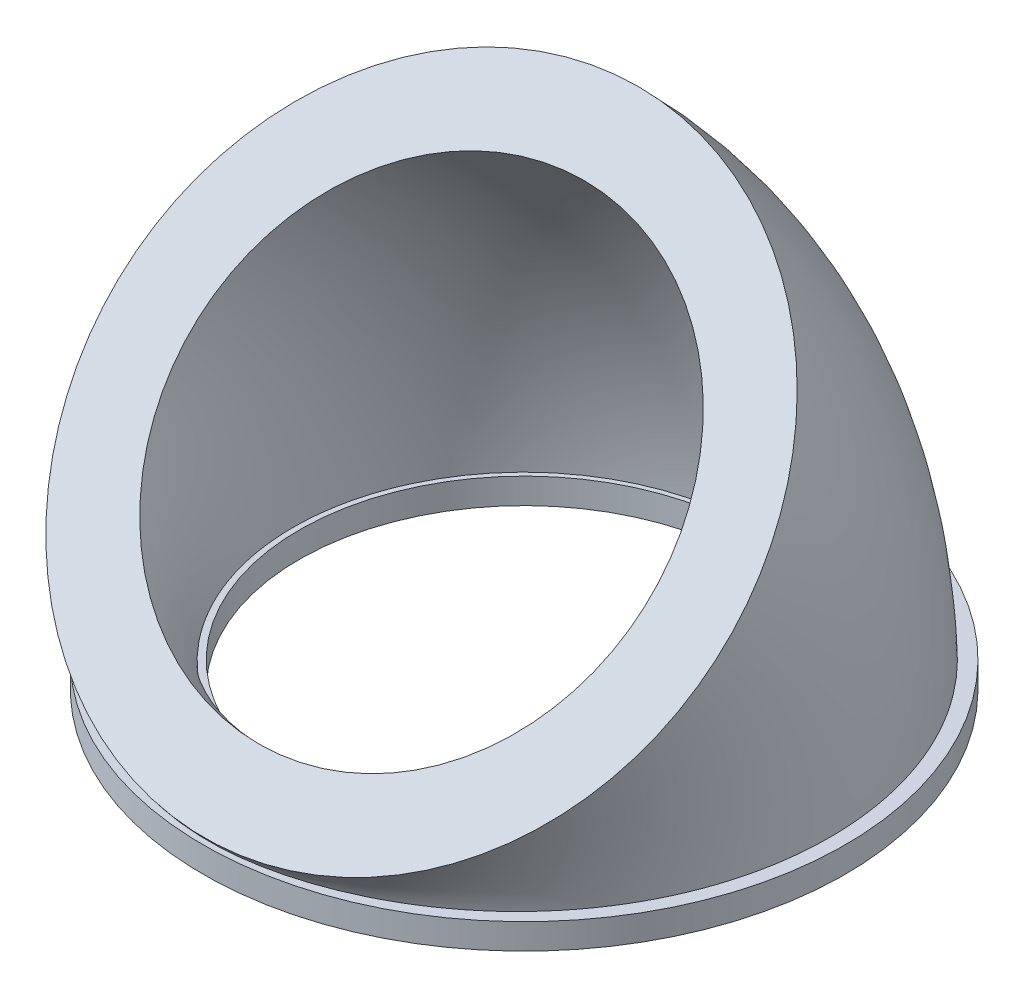
ISO-10303-21;
HEADER;
FILE_DESCRIPTION(('STEP AP214'),'2;1');
FILE_NAME('part.step','',(''),(''),'','','');
FILE_SCHEMA(('AUTOMOTIVE_DESIGN { 1 0 10303 214 1 1 1 1 }'));
ENDSEC;
DATA;
#1=APPLICATION_CONTEXT('core data for automotive mechanical design processes');
#2=APPLICATION_PROTOCOL_DEFINITION('international standard','automotive_design',2000,#1);
#3=PRODUCT_CONTEXT('',#1,'mechanical');
#4=PRODUCT('Part','Part','',(#3));
#5=PRODUCT_RELATED_PRODUCT_CATEGORY('part','',(#4));
#6=PRODUCT_DEFINITION_FORMATION('','',#4);
#7=PRODUCT_DEFINITION_CONTEXT('part definition',#1,'design');
#8=PRODUCT_DEFINITION('design','',#6,#7);
#9=PRODUCT_DEFINITION_SHAPE('','',#8);
#10=(LENGTH_UNIT() NAMED_UNIT(*) SI_UNIT(.MILLI.,.METRE.));
#11=(NAMED_UNIT(*) PLANE_ANGLE_UNIT() SI_UNIT($,.RADIAN.));
#12=(NAMED_UNIT(*) SI_UNIT($,.STERADIAN.) SOLID_ANGLE_UNIT());
#13=UNCERTAINTY_MEASURE_WITH_UNIT(LENGTH_MEASURE(1.E-05),#10,'distance_accuracy_value','');
#14=(GEOMETRIC_REPRESENTATION_CONTEXT(3) GLOBAL_UNCERTAINTY_ASSIGNED_CONTEXT((#13)) GLOBAL_UNIT_ASSIGNED_CONTEXT((#10,
#11,#12)) REPRESENTATION_CONTEXT('',''));
#15=CARTESIAN_POINT('',(0.,0.,0.));
#16=DIRECTION('',(0.,0.,1.));
#17=DIRECTION('',(1.,0.,0.));
#18=AXIS2_PLACEMENT_3D('',#15,#16,#17);
#19=CARTESIAN_POINT('',(0.,-27.4233841458271,-10.));
#20=DIRECTION('',(-1.,0.,0.));
#21=DIRECTION('',(0.,0.,1.));
#22=AXIS2_PLACEMENT_3D('',#19,#20,#21);
#23=TOROIDAL_SURFACE('',#22,27.4233841458271,18.);
#24=CARTESIAN_POINT('',(0.,-8.0321232532291,-29.391260892598));
#25=DIRECTION('',(0.,-0.707106781186547,-0.707106781186547));
#26=DIRECTION('',(0.,0.707106781186548,-0.707106781186548));
#27=AXIS2_PLACEMENT_3D('',#24,#25,#26);
#28=CIRCLE('',#27,18.);
#29=CARTESIAN_POINT('',(0.,4.69579880812875,-42.1191829539559));
#30=VERTEX_POINT('',#29);
#31=EDGE_CURVE('E92',#30,#30,#28,.F.);
#32=ORIENTED_EDGE('',*,*,#31,.T.);
#33=EDGE_LOOP('',(#32));
#34=FACE_BOUND('',#33,.T.);
#35=CARTESIAN_POINT('',(-12.8673389942519,-25.4233841458271,-49.9603268087383));
#36=CARTESIAN_POINT('',(-13.22127898729,-25.4233841458271,-49.5980514448734));
#37=CARTESIAN_POINT('',(-13.5598968853151,-25.4233841458271,-49.2208512059999));
#38=CARTESIAN_POINT('',(-14.0430573726064,-25.4233841458271,-48.6347173289062));
#39=CARTESIAN_POINT('',(-14.2000087899294,-25.4233841458271,-48.4359133725652));
#40=CARTESIAN_POINT('',(-14.5054327316994,-25.4233841458271,-48.0318134599778));
#41=CARTESIAN_POINT('',(-14.653902964633,-25.4233841458271,-47.8265157722657));
#42=CARTESIAN_POINT('',(-15.0863822623848,-25.4233841458271,-47.2011259777443));
#43=CARTESIAN_POINT('',(-15.3572234798953,-25.4233841458271,-46.7718240331977));
#44=CARTESIAN_POINT('',(-15.8617356357748,-25.4233841458271,-45.8919107901087));
#45=CARTESIAN_POINT('',(-16.0954066568381,-25.4233841458271,-45.4412995389771));
#46=CARTESIAN_POINT('',(-16.4167302566389,-25.4233841458271,-44.7520246447946));
#47=CARTESIAN_POINT('',(-16.5189649233989,-25.4233841458271,-44.5200655427819));
#48=CARTESIAN_POINT('',(-16.7135466719222,-25.4233841458271,-44.0521078553894));
#49=CARTESIAN_POINT('',(-16.805896279149,-25.4233841458271,-43.8161103197171));
#50=CARTESIAN_POINT('',(-17.0679203074345,-25.4233841458271,-43.1025438613267));
#51=CARTESIAN_POINT('',(-17.2225867504165,-25.4233841458271,-42.6193650027692));
#52=CARTESIAN_POINT('',(-17.4906673853964,-25.4233841458271,-41.6418990403028));
#53=CARTESIAN_POINT('',(-17.6040922502046,-25.4233841458271,-41.147614845525));
#54=CARTESIAN_POINT('',(-17.789002690455,-25.4233841458271,-40.1512478130978));
#55=CARTESIAN_POINT('',(-17.8604883808088,-25.4233841458271,-39.6491649968203));
#56=CARTESIAN_POINT('',(-17.9611171075555,-25.4233841458271,-38.6399842490112));
#57=CARTESIAN_POINT('',(-17.9901936328877,-25.4233841458271,-38.1328796928988));
#58=CARTESIAN_POINT('',(-18.0056240164112,-25.4233841458271,-37.1180203208683));
#59=CARTESIAN_POINT('',(-17.9919778089794,-25.4233841458271,-36.6102655039525));
#60=CARTESIAN_POINT('',(-17.9220958905224,-25.4233841458271,-35.5976717419738));
#61=CARTESIAN_POINT('',(-17.8658581186314,-25.4233841458271,-35.0928329391982));
#62=CARTESIAN_POINT('',(-17.7112299948006,-25.4233841458271,-34.0896532087089));
#63=CARTESIAN_POINT('',(-17.6128395558906,-25.4233841458271,-33.5913122944039));
#64=CARTESIAN_POINT('',(-17.3742746437865,-25.4233841458271,-32.6031028922983));
#65=CARTESIAN_POINT('',(-17.2339719065843,-25.4233841458271,-32.113265367977));
#66=CARTESIAN_POINT('',(-16.9127322694109,-25.4233841458271,-31.1471017276268));
#67=CARTESIAN_POINT('',(-16.731795296979,-25.4233841458271,-30.6707756356938));
#68=CARTESIAN_POINT('',(-16.3306066487976,-25.4233841458271,-29.7349737398761));
#69=CARTESIAN_POINT('',(-16.1103545815562,-25.4233841458271,-29.27549810384));
#70=CARTESIAN_POINT('',(-15.6321284462026,-25.4233841458271,-28.3766161839419));
#71=CARTESIAN_POINT('',(-15.3741542675022,-25.4233841458271,-27.9372099589217));
#72=CARTESIAN_POINT('',(-14.8211699028884,-25.4233841458271,-27.0797359692378));
#73=CARTESIAN_POINT('',(-14.526008697728,-25.4233841458271,-26.6617655906432));
#74=CARTESIAN_POINT('',(-13.9016174699892,-25.4233841458271,-25.8520967905658));
#75=CARTESIAN_POINT('',(-13.5723873265887,-25.4233841458271,-25.4603984622622));
#76=CARTESIAN_POINT('',(-12.8821667841321,-25.4233841458271,-24.7060121170377));
#77=CARTESIAN_POINT('',(-12.5211741917677,-25.4233841458271,-24.3433261068259));
#78=CARTESIAN_POINT('',(-11.7699838430686,-25.4233841458271,-23.6495748984781));
#79=CARTESIAN_POINT('',(-11.3797860374112,-25.4233841458271,-23.3185097537468));
#80=CARTESIAN_POINT('',(-10.5718266395488,-25.4233841458271,-22.6895537856968));
#81=CARTESIAN_POINT('',(-10.1539940627221,-25.4233841458271,-22.3917541324767));
#82=CARTESIAN_POINT('',(-9.29462199510146,-25.4233841458271,-21.8325776879138));
#83=CARTESIAN_POINT('',(-8.85308240118584,-25.4233841458271,-21.5712010550231));
#84=CARTESIAN_POINT('',(-7.94940208065951,-25.4233841458271,-21.0869148009635));
#85=CARTESIAN_POINT('',(-7.48726205947704,-25.4233841458271,-20.8640038638705));
#86=CARTESIAN_POINT('',(-6.54562678744285,-25.4233841458271,-20.4584717940819));
#87=CARTESIAN_POINT('',(-6.06613171436241,-25.4233841458271,-20.2758502488298));
#88=CARTESIAN_POINT('',(-5.09733922124915,-25.4233841458271,-19.9538673648576));
#89=CARTESIAN_POINT('',(-4.60815934661876,-25.4233841458271,-19.8141524445216));
#90=CARTESIAN_POINT('',(-3.61961347423631,-25.4233841458271,-19.5771936118676));
#91=CARTESIAN_POINT('',(-3.12024754811763,-25.4233841458271,-19.4799494009821));
#92=CARTESIAN_POINT('',(-2.11508263246179,-25.4233841458271,-19.3289009371675));
#93=CARTESIAN_POINT('',(-1.60928490574644,-25.4233841458271,-19.2750882866582));
#94=CARTESIAN_POINT('',(-0.594932997183733,-25.4233841458271,-19.2114255564899));
#95=CARTESIAN_POINT('',(-0.0863788624486613,-25.4233841458271,-19.201574727797));
#96=CARTESIAN_POINT('',(0.918745478439486,-25.4233841458271,-19.2256732368799));
#97=CARTESIAN_POINT('',(1.415338411143,-25.4233841458271,-19.2586860888581));
#98=CARTESIAN_POINT('',(2.40394864966357,-25.4233841458271,-19.366569466441));
#99=CARTESIAN_POINT('',(2.89596601667815,-25.4233841458271,-19.4414394313921));
#100=CARTESIAN_POINT('',(3.87198687069252,-25.4233841458271,-19.6323232891759));
#101=CARTESIAN_POINT('',(4.3559897225033,-25.4233841458271,-19.7483404269392));
#102=CARTESIAN_POINT('',(5.31259015038147,-25.4233841458271,-20.0204596722467));
#103=CARTESIAN_POINT('',(5.78518761537671,-25.4233841458271,-20.1765621699926));
#104=CARTESIAN_POINT('',(6.71630920440257,-25.4233841458271,-20.5277230480183));
#105=CARTESIAN_POINT('',(7.17481611580262,-25.4233841458271,-20.7228270468689));
#106=CARTESIAN_POINT('',(8.07410311276838,-25.4233841458271,-21.150308715827));
#107=CARTESIAN_POINT('',(8.51488324585425,-25.4233841458271,-21.3826862860071));
#108=CARTESIAN_POINT('',(9.37582507896328,-25.4233841458271,-21.8829724771248));
#109=CARTESIAN_POINT('',(9.79598560326827,-25.4233841458271,-22.1508831209203));
#110=CARTESIAN_POINT('',(10.6128953967289,-25.4233841458271,-22.7202940207847));
#111=CARTESIAN_POINT('',(11.00964432312,-25.4233841458271,-23.0217947684531));
#112=CARTESIAN_POINT('',(11.7852893422134,-25.4233841458271,-23.6630475862038));
#113=CARTESIAN_POINT('',(12.1636251839205,-25.4233841458271,-24.0034776103334));
#114=CARTESIAN_POINT('',(12.8905270290648,-25.4233841458271,-24.7147651500442));
#115=CARTESIAN_POINT('',(13.2390926448981,-25.4233841458271,-25.0856230616687));
#116=CARTESIAN_POINT('',(13.9040329165932,-25.4233841458271,-25.8551756172776));
#117=CARTESIAN_POINT('',(14.2204066013384,-25.4233841458271,-26.2538711004115));
#118=CARTESIAN_POINT('',(14.8187259154273,-25.4233841458271,-27.0763083088157));
#119=CARTESIAN_POINT('',(15.1006715044427,-25.4233841458271,-27.5000500634236));
#120=CARTESIAN_POINT('',(15.6302318617216,-25.4233841458271,-28.3730899114821));
#121=CARTESIAN_POINT('',(15.8775560235134,-25.4233841458271,-28.8225643268408));
#122=CARTESIAN_POINT('',(16.3333949889262,-25.4233841458271,-29.7407837646239));
#123=CARTESIAN_POINT('',(16.5419095258524,-25.4233841458271,-30.2095289194473));
#124=CARTESIAN_POINT('',(16.9185958015798,-25.4233841458271,-31.1629616915369));
#125=CARTESIAN_POINT('',(17.0867673969814,-25.4233841458271,-31.6476493654641));
#126=CARTESIAN_POINT('',(17.381515781354,-25.4233841458271,-32.6295108162576));
#127=CARTESIAN_POINT('',(17.5080927370204,-25.4233841458271,-33.1266845430761));
#128=CARTESIAN_POINT('',(17.7184190727548,-25.4233841458271,-34.1286358336675));
#129=CARTESIAN_POINT('',(17.8022809278958,-25.4233841458271,-34.6333897872241));
#130=CARTESIAN_POINT('',(17.9270366074452,-25.4233841458271,-35.648181301322));
#131=CARTESIAN_POINT('',(17.9679304673323,-25.4233841458271,-36.1582188575002));
#132=CARTESIAN_POINT('',(18.0064147170119,-25.4233841458271,-37.1799176254889));
#133=CARTESIAN_POINT('',(18.0040058123927,-25.4233841458271,-37.6915788107077));
#134=CARTESIAN_POINT('',(17.9558648179577,-25.4233841458271,-38.7128591918099));
#135=CARTESIAN_POINT('',(17.9101328541752,-25.4233841458271,-39.2224783936294));
#136=CARTESIAN_POINT('',(17.7759223182169,-25.4233841458271,-40.2338824637027));
#137=CARTESIAN_POINT('',(17.6876236511079,-25.4233841458271,-40.7356912103847));
#138=CARTESIAN_POINT('',(17.4689579826757,-25.4233841458271,-41.7300578089467));
#139=CARTESIAN_POINT('',(17.3385910909482,-25.4233841458271,-42.2226156849234));
#140=CARTESIAN_POINT('',(17.0366966025323,-25.4233841458271,-43.1949448418903));
#141=CARTESIAN_POINT('',(16.8651695663733,-25.4233841458271,-43.6747162969104));
#142=CARTESIAN_POINT('',(16.4821588011217,-25.4233841458271,-44.6180361598305));
#143=CARTESIAN_POINT('',(16.2706751358363,-25.4233841458271,-45.0815845936358));
#144=CARTESIAN_POINT('',(15.8099611846555,-25.4233841458271,-45.9877233881757));
#145=CARTESIAN_POINT('',(15.5608495889455,-25.4233841458271,-46.4303740990363));
#146=CARTESIAN_POINT('',(15.0261634657792,-25.4233841458271,-47.2930763707128));
#147=CARTESIAN_POINT('',(14.7405890147418,-25.4233841458271,-47.7131279788893));
#148=CARTESIAN_POINT('',(14.1350030850947,-25.4233841458271,-48.527623046095));
#149=CARTESIAN_POINT('',(13.8149918328002,-25.4233841458271,-48.9220666733899));
#150=CARTESIAN_POINT('',(13.1428046109194,-25.4233841458271,-49.6825230124747));
#151=CARTESIAN_POINT('',(12.7906286694387,-25.4233841458271,-50.048535749107));
#152=CARTESIAN_POINT('',(12.0573325706652,-25.4233841458271,-50.7488255480964));
#153=CARTESIAN_POINT('',(11.6762699215256,-25.4233841458271,-51.0831628310655));
#154=CARTESIAN_POINT('',(10.8873093633097,-25.4233841458271,-51.71851394845));
#155=CARTESIAN_POINT('',(10.4794114906816,-25.4233841458271,-52.0195278281246));
#156=CARTESIAN_POINT('',(9.63968228353082,-25.4233841458271,-52.5860794847574));
#157=CARTESIAN_POINT('',(9.20785102107229,-25.4233841458271,-52.8516173685266));
#158=CARTESIAN_POINT('',(8.32332772968958,-25.4233841458271,-53.3453189135021));
#159=CARTESIAN_POINT('',(7.87063571083879,-25.4233841458271,-53.5734825927555));
#160=CARTESIAN_POINT('',(6.94812618906445,-25.4233841458271,-53.9905725684578));
#161=CARTESIAN_POINT('',(6.47832816498741,-25.4233841458271,-54.1795419488315));
#162=CARTESIAN_POINT('',(5.52447650041942,-25.4233841458271,-54.5172109640207));
#163=CARTESIAN_POINT('',(5.04042286873609,-25.4233841458271,-54.6659106237157));
#164=CARTESIAN_POINT('',(4.06152416462753,-25.4233841458271,-54.9219726994479));
#165=CARTESIAN_POINT('',(3.56667954616905,-25.4233841458271,-55.0293368509001));
#166=CARTESIAN_POINT('',(2.56970293725422,-25.4233841458271,-55.2019701229618));
#167=CARTESIAN_POINT('',(2.06757095560337,-25.4233841458271,-55.2672392944313));
#168=CARTESIAN_POINT('',(1.0599229744158,-25.4233841458271,-55.3551860353629));
#169=CARTESIAN_POINT('',(0.55440944686945,-25.4233841458271,-55.3778918947942));
#170=CARTESIAN_POINT('',(-0.456717911714988,-25.4233841458271,-55.3806406266289));
#171=CARTESIAN_POINT('',(-0.962331743097287,-25.4233841458271,-55.3606833500006));
#172=CARTESIAN_POINT('',(-1.97027405168103,-25.4233841458271,-55.2782198320547));
#173=CARTESIAN_POINT('',(-2.47260165860809,-25.4233841458271,-55.2157027464727));
#174=CARTESIAN_POINT('',(-3.2206407628951,-25.4233841458271,-55.0903874157675));
#175=CARTESIAN_POINT('',(-3.46908808766829,-25.4233841458271,-55.0433565491624));
#176=CARTESIAN_POINT('',(-3.96384453348637,-25.4233841458271,-54.9388520264274));
#177=CARTESIAN_POINT('',(-4.21015309176606,-25.4233841458271,-54.8813757041518));
#178=CARTESIAN_POINT('',(-4.94520129811733,-25.4233841458271,-54.6934115865622));
#179=CARTESIAN_POINT('',(-5.4300555660959,-25.4233841458271,-54.5473899668028));
#180=CARTESIAN_POINT('',(-6.38572972379729,-25.4233841458271,-54.2149896681923));
#181=CARTESIAN_POINT('',(-6.85654956035937,-25.4233841458271,-54.028610836495));
#182=CARTESIAN_POINT('',(-7.54942734700609,-25.4233841458271,-53.719940150175));
#183=CARTESIAN_POINT('',(-7.77808075255478,-25.4233841458271,-53.612243854131));
#184=CARTESIAN_POINT('',(-8.23058937457469,-25.4233841458271,-53.3873464790641));
#185=CARTESIAN_POINT('',(-8.45444586620603,-25.4233841458271,-53.2701479666515));
#186=CARTESIAN_POINT('',(-9.11822080150776,-25.4233841458271,-52.9046096906629));
#187=CARTESIAN_POINT('',(-9.55050753578366,-25.4233841458271,-52.642254617272));
#188=CARTESIAN_POINT('',(-10.4938613528003,-25.4233841458271,-52.0138850643813));
#189=CARTESIAN_POINT('',(-10.998496151371,-25.4233841458271,-51.6381822253663));
#190=CARTESIAN_POINT('',(-11.9657248690622,-25.4233841458271,-50.8360827184446));
#191=CARTESIAN_POINT('',(-12.4283187856273,-25.4233841458271,-50.4096860474564));
#192=CARTESIAN_POINT('',(-12.8673389942519,-25.4233841458271,-49.9603268087383));
#193=B_SPLINE_CURVE_WITH_KNOTS('',3,(#35,#36,#37,#38,#39,#40,#41,#42,#43,#44,#45,#46,#47,#48,
#49,#50,#51,#52,#53,#54,#55,#56,#57,#58,#59,#60,#61,#62,#63,#64,#65,#66,#67,#68,#69,#70,#71,#72,
#73,#74,#75,#76,#77,#78,#79,#80,#81,#82,#83,#84,#85,#86,#87,#88,#89,#90,#91,#92,#93,#94,#95,#96,
#97,#98,#99,#100,#101,#102,#103,#104,#105,#106,#107,#108,#109,#110,#111,#112,#113,#114,#115,
#116,#117,#118,#119,#120,#121,#122,#123,#124,#125,#126,#127,#128,#129,#130,#131,#132,#133,#134,
#135,#136,#137,#138,#139,#140,#141,#142,#143,#144,#145,#146,#147,#148,#149,#150,#151,#152,#153,
#154,#155,#156,#157,#158,#159,#160,#161,#162,#163,#164,#165,#166,#167,#168,#169,#170,#171,#172,
#173,#174,#175,#176,#177,#178,#179,#180,#181,#182,#183,#184,#185,#186,#187,#188,#189,#190,#191,
#192),.UNSPECIFIED.,.T.,.F.,(4,2,2,2,2,2,2,2,2,2,2,2,2,2,2,2,2,2,2,2,2,2,2,2,2,2,2,2,2,2,2,2,2,
2,2,2,2,2,2,2,2,2,2,2,2,2,2,2,2,2,2,2,2,2,2,2,2,2,2,2,2,2,2,2,2,2,2,2,2,2,2,2,2,2,2,2,2,2,4),
(0.,1.51881080097557,2.27848581711989,3.03836512677905,4.55923543960673,6.08010236883053,
6.84037316357209,7.60044925619327,9.12048239403759,10.6401218856653,12.1597572135218,
13.6817732597837,15.2037916438989,16.725883678188,18.2479788529011,19.774780657599,
21.3015851849747,22.8284049168161,24.3552291248633,25.888466812589,27.4217099379736,
28.9550590223888,30.4884106964355,32.0258667105597,33.5633294129099,35.1007395077252,
36.6381338589937,38.16249617985,39.6868477843265,41.21090458167,42.7349354115984,
44.2262229164468,45.7174904467757,47.2088756069625,48.7002752852497,50.1934297129264,
51.6865801376406,53.1798156022442,54.6730729235906,56.1981359649437,57.723218859366,
59.2483477465104,60.77347842014,62.3107282548784,63.8479886530162,65.3852545152925,
66.9225142167249,68.4557048881577,69.9888942936354,71.5220587168889,73.0552186799538,
74.5819549195222,76.1086871816888,77.6353986536084,79.1621076875278,80.6840978668401,
82.2060848564092,83.7280618442424,85.2500375021825,86.7690589745326,88.2880783837542,
89.8070932194121,91.3261073215649,92.8434427087933,94.3607771585787,95.8780478981978,
97.3953168046148,98.9115768907895,100.427842273605,101.944494146406,102.702879802517,
103.461459304997,104.978642297685,106.495831036551,107.253875624548,108.011716137568,
109.526864106388,111.410767048383,113.294670104892),.UNSPECIFIED.);
#194=CARTESIAN_POINT('',(-12.8673389942519,-25.4233841458271,-49.9603268087383));
#195=VERTEX_POINT('',#194);
#196=EDGE_CURVE('E10',#195,#195,#193,.T.);
#197=ORIENTED_EDGE('',*,*,#196,.F.);
#198=EDGE_LOOP('',(#197));
#199=FACE_BOUND('',#198,.T.);
#200=ADVANCED_FACE('F33',(#34,#199),#23,.F.);
#201=CARTESIAN_POINT('',(0.,-27.4233841458271,-10.));
#202=DIRECTION('',(-1.,0.,0.));
#203=DIRECTION('',(0.,0.,1.));
#204=AXIS2_PLACEMENT_3D('',#201,#202,#203);
#205=TOROIDAL_SURFACE('',#204,27.4233841458271,24.);
#206=CARTESIAN_POINT('',(0.,-8.0321232532291,-29.391260892598));
#207=DIRECTION('',(0.,-0.707106781186547,-0.707106781186547));
#208=DIRECTION('',(0.,0.707106781186548,-0.707106781186548));
#209=AXIS2_PLACEMENT_3D('',#206,#207,#208);
#210=CIRCLE('',#209,24.);
#211=CARTESIAN_POINT('',(0.,8.93843949524804,-46.3618236410751));
#212=VERTEX_POINT('',#211);
#213=EDGE_CURVE('E50',#212,#212,#210,.T.);
#214=ORIENTED_EDGE('',*,*,#213,.T.);
#215=EDGE_LOOP('',(#214));
#216=FACE_BOUND('',#215,.T.);
#217=CARTESIAN_POINT('',(-17.0079155178827,-25.4233841458271,-54.3113995799606));
#218=CARTESIAN_POINT('',(-16.5324612347913,-25.4233841458271,-54.7894359532409));
#219=CARTESIAN_POINT('',(-16.0368107429161,-25.4233841458271,-55.2474735019813));
#220=CARTESIAN_POINT('',(-15.0086662780967,-25.4233841458271,-56.1202249265997));
#221=CARTESIAN_POINT('',(-14.4761676944385,-25.4233841458271,-56.5349333644551));
#222=CARTESIAN_POINT('',(-13.3778352319365,-25.4233841458271,-57.3182511024736));
#223=CARTESIAN_POINT('',(-12.8119835393426,-25.4233841458271,-57.6868354336855));
#224=CARTESIAN_POINT('',(-11.6512518298994,-25.4233841458271,-58.374995676379));
#225=CARTESIAN_POINT('',(-11.0563727262388,-25.4233841458271,-58.6945731282855));
#226=CARTESIAN_POINT('',(-9.84192143055866,-25.4233841458271,-59.282396317542));
#227=CARTESIAN_POINT('',(-9.2223543165692,-25.4233841458271,-59.5506525458759));
#228=CARTESIAN_POINT('',(-7.96281357611869,-25.4233841458271,-60.0340027825281));
#229=CARTESIAN_POINT('',(-7.32283979685449,-25.4233841458271,-60.2490963926641));
#230=CARTESIAN_POINT('',(-6.02711875510084,-25.4233841458271,-60.6245626121567));
#231=CARTESIAN_POINT('',(-5.37137337185056,-25.4233841458271,-60.7849417066896));
#232=CARTESIAN_POINT('',(-4.0487013125602,-25.4233841458271,-61.0498701921955));
#233=CARTESIAN_POINT('',(-3.38177465943237,-25.4233841458271,-61.154419697558));
#234=CARTESIAN_POINT('',(-2.04165250222545,-25.4233841458271,-61.3069246587908));
#235=CARTESIAN_POINT('',(-1.36845862323132,-25.4233841458271,-61.3548943952483));
#236=CARTESIAN_POINT('',(-0.0204226365821484,-25.4233841458271,-61.3939457488149));
#237=CARTESIAN_POINT('',(0.65441947150485,-25.4233841458271,-61.3850273510137));
#238=CARTESIAN_POINT('',(2.00096302424663,-25.4233841458271,-61.3103653998751));
#239=CARTESIAN_POINT('',(2.67266442153175,-25.4233841458271,-61.244620992223));
#240=CARTESIAN_POINT('',(4.00813991628578,-25.4233841458271,-61.0567745235654));
#241=CARTESIAN_POINT('',(4.67191401458382,-25.4233841458271,-60.9346724684545));
#242=CARTESIAN_POINT('',(5.98674010706616,-25.4233841458271,-60.6349982421481));
#243=CARTESIAN_POINT('',(6.63779355010674,-25.4233841458271,-60.4574324277565));
#244=CARTESIAN_POINT('',(7.92262951715957,-25.4233841458271,-60.0480915328455));
#245=CARTESIAN_POINT('',(8.55641204328577,-25.4233841458271,-59.8163164589614));
#246=CARTESIAN_POINT('',(9.80220324346082,-25.4233841458271,-59.3002083938574));
#247=CARTESIAN_POINT('',(10.4142119157396,-25.4233841458271,-59.0158753983652));
#248=CARTESIAN_POINT('',(11.6121087444552,-25.4233841458271,-58.3966770286395));
#249=CARTESIAN_POINT('',(12.1979968962395,-25.4233841458271,-58.0618116454059));
#250=CARTESIAN_POINT('',(13.3395967801545,-25.4233841458271,-57.343868643752));
#251=CARTESIAN_POINT('',(13.8953030384529,-25.4233841458271,-56.9607823214309));
#252=CARTESIAN_POINT('',(14.9724812143732,-25.4233841458271,-56.1491738629249));
#253=CARTESIAN_POINT('',(15.4939531316254,-25.4233841458271,-55.7206517262492));
#254=CARTESIAN_POINT('',(16.4989638068204,-25.4233841458271,-54.8212243911545));
#255=CARTESIAN_POINT('',(16.9825026635908,-25.4233841458271,-54.350319303163));
#256=CARTESIAN_POINT('',(17.908224086183,-25.4233841458271,-53.3694772269208));
#257=CARTESIAN_POINT('',(18.350406635598,-25.4233841458271,-52.8595402231853));
#258=CARTESIAN_POINT('',(19.190510426697,-25.4233841458271,-51.8039833733322));
#259=CARTESIAN_POINT('',(19.5884081296199,-25.4233841458271,-51.2583447930726));
#260=CARTESIAN_POINT('',(20.336861335624,-25.4233841458271,-50.1355111296893));
#261=CARTESIAN_POINT('',(20.6874168312422,-25.4233841458271,-49.5583160415911));
#262=CARTESIAN_POINT('',(21.3387188464543,-25.4233841458271,-48.3764696561757));
#263=CARTESIAN_POINT('',(21.6394648704053,-25.4233841458271,-47.7718180857214));
#264=CARTESIAN_POINT('',(22.1890331357678,-25.4233841458271,-46.5393619039736));
#265=CARTESIAN_POINT('',(22.4378553352543,-25.4233841458271,-45.911557273986));
#266=CARTESIAN_POINT('',(22.8820885886181,-25.4233841458271,-44.6365392920339));
#267=CARTESIAN_POINT('',(23.0774395520793,-25.4233841458271,-43.9893050038925));
#268=CARTESIAN_POINT('',(23.4130091465528,-25.4233841458271,-42.6806997847965));
#269=CARTESIAN_POINT('',(23.5532277596582,-25.4233841458271,-42.0193288492503));
#270=CARTESIAN_POINT('',(23.7775766342045,-25.4233841458271,-40.6871649004617));
#271=CARTESIAN_POINT('',(23.8617087433352,-25.4233841458271,-40.0163721983493));
#272=CARTESIAN_POINT('',(23.9733471386143,-25.4233841458271,-38.6700921402951));
#273=CARTESIAN_POINT('',(24.0008533408966,-25.4233841458271,-37.9946047774016));
#274=CARTESIAN_POINT('',(23.9991043899247,-25.4233841458271,-36.6422195007171));
#275=CARTESIAN_POINT('',(23.9697243707305,-25.4233841458271,-35.9653217491742));
#276=CARTESIAN_POINT('',(23.85423757476,-25.4233841458271,-34.6163852004375));
#277=CARTESIAN_POINT('',(23.7681307627374,-25.4233841458271,-33.9443464062631));
#278=CARTESIAN_POINT('',(23.5398746685924,-25.4233841458271,-32.6097728938472));
#279=CARTESIAN_POINT('',(23.3977185743905,-25.4233841458271,-31.9472393409948));
#280=CARTESIAN_POINT('',(23.0584740139489,-25.4233841458271,-30.6363908347322));
#281=CARTESIAN_POINT('',(22.861385360649,-25.4233841458271,-29.9880759297485));
#282=CARTESIAN_POINT('',(22.4126775940811,-25.4233841458271,-28.7069887384219));
#283=CARTESIAN_POINT('',(22.1607928609669,-25.4233841458271,-28.0743094919903));
#284=CARTESIAN_POINT('',(21.6050078370257,-25.4233841458271,-26.8322322489796));
#285=CARTESIAN_POINT('',(21.3011074769781,-25.4233841458271,-26.2228342833836));
#286=CARTESIAN_POINT('',(20.6437388234476,-25.4233841458271,-25.0317044300954));
#287=CARTESIAN_POINT('',(20.2902898953401,-25.4233841458271,-24.4499618520603));
#288=CARTESIAN_POINT('',(19.5364148435508,-25.4233841458271,-23.3177648527672));
#289=CARTESIAN_POINT('',(19.1359884720533,-25.4233841458271,-22.7673105965842));
#290=CARTESIAN_POINT('',(18.2864833814077,-25.4233841458271,-21.6953332483596));
#291=CARTESIAN_POINT('',(17.8369141528689,-25.4233841458271,-21.1741989117838));
#292=CARTESIAN_POINT('',(16.8962608551802,-25.4233841458271,-20.1708636776699));
#293=CARTESIAN_POINT('',(16.4051763619759,-25.4233841458271,-19.688663177917));
#294=CARTESIAN_POINT('',(15.3846466278133,-25.4233841458271,-18.7656063169983));
#295=CARTESIAN_POINT('',(14.8551613075965,-25.4233841458271,-18.3247942868295));
#296=CARTESIAN_POINT('',(13.7621985974519,-25.4233841458271,-17.4875822359866));
#297=CARTESIAN_POINT('',(13.1987211486909,-25.4233841458271,-17.091182292184));
#298=CARTESIAN_POINT('',(12.0254121950633,-25.4233841458271,-16.3343597045664));
#299=CARTESIAN_POINT('',(11.4147210107696,-25.4233841458271,-15.9752692391128));
#300=CARTESIAN_POINT('',(10.1659053343582,-25.4233841458271,-15.3083552176979));
#301=CARTESIAN_POINT('',(9.52777755970201,-25.4233841458271,-15.0005378176861));
#302=CARTESIAN_POINT('',(8.22869952425467,-25.4233841458271,-14.4387549639843));
#303=CARTESIAN_POINT('',(7.5677676300788,-25.4233841458271,-14.1847472968833));
#304=CARTESIAN_POINT('',(6.56211521889187,-25.4233841458271,-13.8467078381197));
#305=CARTESIAN_POINT('',(6.22450231618976,-25.4233841458271,-13.7411852307422));
#306=CARTESIAN_POINT('',(5.54497261127547,-25.4233841458271,-13.5451219841273));
#307=CARTESIAN_POINT('',(5.20305601767969,-25.4233841458271,-13.4545806216781));
#308=CARTESIAN_POINT('',(4.29602264375459,-25.4233841458271,-13.2365516942833));
#309=CARTESIAN_POINT('',(3.72760827138143,-25.4233841458271,-13.1223205929288));
#310=CARTESIAN_POINT('',(2.86963064961533,-25.4233841458271,-12.9859875933944));
#311=CARTESIAN_POINT('',(2.58274952199152,-25.4233841458271,-12.9463791811757));
#312=CARTESIAN_POINT('',(2.00757605333999,-25.4233841458271,-12.8793515449324));
#313=CARTESIAN_POINT('',(1.71928388530275,-25.4233841458271,-12.851930862777));
#314=CARTESIAN_POINT('',(1.14230861338206,-25.4233841458271,-12.8097482737353));
#315=CARTESIAN_POINT('',(0.853627205038425,-25.4233841458271,-12.7949631660167));
#316=CARTESIAN_POINT('',(0.275891918839661,-25.4233841458271,-12.7782245412945));
#317=CARTESIAN_POINT('',(-0.0131619569970519,-25.4233841458271,-12.7762709550466));
#318=CARTESIAN_POINT('',(-0.591094300338743,-25.4233841458271,-12.7852337385369));
#319=CARTESIAN_POINT('',(-0.879972753414482,-25.4233841458271,-12.7961510527615));
#320=CARTESIAN_POINT('',(-1.45695331433643,-25.4233841458271,-12.8306537838074));
#321=CARTESIAN_POINT('',(-1.74505541717109,-25.4233841458271,-12.8542392822095));
#322=CARTESIAN_POINT('',(-2.60553371643948,-25.4233841458271,-12.9432540780318));
#323=CARTESIAN_POINT('',(-3.17610349447064,-25.4233841458271,-13.0269776753143));
#324=CARTESIAN_POINT('',(-4.30875295134667,-25.4233841458271,-13.2390708370752));
#325=CARTESIAN_POINT('',(-4.87083159364336,-25.4233841458271,-13.3674458071058));
#326=CARTESIAN_POINT('',(-5.98559253467937,-25.4233841458271,-13.6651937360726));
#327=CARTESIAN_POINT('',(-6.53824653559982,-25.4233841458271,-13.8346726434569));
#328=CARTESIAN_POINT('',(-7.63029012669774,-25.4233841458271,-14.2114362718131));
#329=CARTESIAN_POINT('',(-8.16967959641138,-25.4233841458271,-14.4187213359836));
#330=CARTESIAN_POINT('',(-9.9007196562097,-25.4233841458271,-15.1519923825334));
#331=CARTESIAN_POINT('',(-11.0625062810803,-25.4233841458271,-15.7517848461844));
#332=CARTESIAN_POINT('',(-12.7253195572612,-25.4233841458271,-16.7763492472734));
#333=CARTESIAN_POINT('',(-13.2662071572153,-25.4233841458271,-17.1386219743251));
#334=CARTESIAN_POINT('',(-14.3189065007994,-25.4233841458271,-17.9035709178387));
#335=CARTESIAN_POINT('',(-14.8307170961012,-25.4233841458271,-18.3062487282698));
#336=CARTESIAN_POINT('',(-15.8757965897083,-25.4233841458271,-19.1959634974136));
#337=CARTESIAN_POINT('',(-16.4053140617468,-25.4233841458271,-19.6874110206305));
#338=CARTESIAN_POINT('',(-17.4199199811401,-25.4233841458271,-20.7143084774131));
#339=CARTESIAN_POINT('',(-17.9050047328789,-25.4233841458271,-21.2497620640939));
#340=CARTESIAN_POINT('',(-18.8268694429988,-25.4233841458271,-22.3612345539471));
#341=CARTESIAN_POINT('',(-19.2636243611031,-25.4233841458271,-22.9372742346516));
#342=CARTESIAN_POINT('',(-20.0848227290459,-25.4233841458271,-24.1254890737111));
#343=CARTESIAN_POINT('',(-20.4692685654104,-25.4233841458271,-24.7376625816841));
#344=CARTESIAN_POINT('',(-21.1709800416496,-25.4233841458271,-25.9731441914127));
#345=CARTESIAN_POINT('',(-21.4900234394847,-25.4233841458271,-26.595443240161));
#346=CARTESIAN_POINT('',(-22.0735283507929,-25.4233841458271,-27.8651277910511));
#347=CARTESIAN_POINT('',(-22.337990717413,-25.4233841458271,-28.5125129008889));
#348=CARTESIAN_POINT('',(-22.8101351972583,-25.4233841458271,-29.8274882263367));
#349=CARTESIAN_POINT('',(-23.0178313799846,-25.4233841458271,-30.4950733897189));
#350=CARTESIAN_POINT('',(-23.374833648102,-25.4233841458271,-31.8456784278153));
#351=CARTESIAN_POINT('',(-23.524140410491,-25.4233841458271,-32.5286981234763));
#352=CARTESIAN_POINT('',(-23.7606683988842,-25.4233841458271,-33.8909247698951));
#353=CARTESIAN_POINT('',(-23.8491033358181,-25.4233841458271,-34.5699212386975));
#354=CARTESIAN_POINT('',(-23.968045656608,-25.4233841458271,-35.9329666898784));
#355=CARTESIAN_POINT('',(-23.9985537896243,-25.4233841458271,-36.6170156067994));
#356=CARTESIAN_POINT('',(-24.0013458977556,-25.4233841458271,-37.9853022006891));
#357=CARTESIAN_POINT('',(-23.9736239681619,-25.4233841458271,-38.6695398897652));
#358=CARTESIAN_POINT('',(-23.8600816217625,-25.4233841458271,-40.0331746537019));
#359=CARTESIAN_POINT('',(-23.7742617664509,-25.4233841458271,-40.7125717752806));
#360=CARTESIAN_POINT('',(-23.5460003089751,-25.4233841458271,-42.0562729867477));
#361=CARTESIAN_POINT('',(-23.4040102793857,-25.4233841458271,-42.7206538278309));
#362=CARTESIAN_POINT('',(-23.0643762269812,-25.4233841458271,-44.0350582891991));
#363=CARTESIAN_POINT('',(-22.8667307614509,-25.4233841458271,-44.6850815368316));
#364=CARTESIAN_POINT('',(-22.4173034102336,-25.4233841458271,-45.9657127496775));
#365=CARTESIAN_POINT('',(-22.1655522138361,-25.4233841458271,-46.5963314904646));
#366=CARTESIAN_POINT('',(-21.6096347706059,-25.4233841458271,-47.8339683036032));
#367=CARTESIAN_POINT('',(-21.3054752963363,-25.4233841458271,-48.4409894129983));
#368=CARTESIAN_POINT('',(-20.7082939305401,-25.4233841458271,-49.5165648056185));
#369=CARTESIAN_POINT('',(-20.4237493503616,-25.4233841458271,-49.9898509593561));
#370=CARTESIAN_POINT('',(-19.822654944879,-25.4233841458271,-50.9158290701937));
#371=CARTESIAN_POINT('',(-19.5060975545441,-25.4233841458271,-51.3685161226482));
#372=CARTESIAN_POINT('',(-18.8425380637392,-25.4233841458271,-52.2509942954503));
#373=CARTESIAN_POINT('',(-18.4955361290093,-25.4233841458271,-52.6807855404224));
#374=CARTESIAN_POINT('',(-17.7728350628611,-25.4233841458271,-53.5153146594567));
#375=CARTESIAN_POINT('',(-17.3971427998861,-25.4233841458271,-53.9200584881088));
#376=CARTESIAN_POINT('',(-17.0079155178827,-25.4233841458271,-54.3113995799606));
#377=B_SPLINE_CURVE_WITH_KNOTS('',3,(#217,#218,#219,#220,#221,#222,#223,#224,#225,#226,#227,
#228,#229,#230,#231,#232,#233,#234,#235,#236,#237,#238,#239,#240,#241,#242,#243,#244,#245,#246,
#247,#248,#249,#250,#251,#252,#253,#254,#255,#256,#257,#258,#259,#260,#261,#262,#263,#264,#265,
#266,#267,#268,#269,#270,#271,#272,#273,#274,#275,#276,#277,#278,#279,#280,#281,#282,#283,#284,
#285,#286,#287,#288,#289,#290,#291,#292,#293,#294,#295,#296,#297,#298,#299,#300,#301,#302,#303,
#304,#305,#306,#307,#308,#309,#310,#311,#312,#313,#314,#315,#316,#317,#318,#319,#320,#321,#322,
#323,#324,#325,#326,#327,#328,#329,#330,#331,#332,#333,#334,#335,#336,#337,#338,#339,#340,#341,
#342,#343,#344,#345,#346,#347,#348,#349,#350,#351,#352,#353,#354,#355,#356,#357,#358,#359,#360,
#361,#362,#363,#364,#365,#366,#367,#368,#369,#370,#371,#372,#373,#374,#375,#376),.UNSPECIFIED.,
.T.,.F.,(4,2,2,2,2,2,2,2,2,2,2,2,2,2,2,2,2,2,2,2,2,2,2,2,2,2,2,2,2,2,2,2,2,2,2,2,2,2,2,2,2,2,2,
2,2,2,2,2,2,2,2,2,2,2,2,2,2,2,2,2,2,2,2,2,2,2,2,2,2,2,2,2,2,2,2,2,2,2,2,4),(0.,2.02217654330705,
4.04460657589768,6.06812674321625,8.09158329252991,10.1146257678264,12.1376833950296,
14.1605011508327,16.1833147620564,18.2056177110327,20.2279211900493,22.2502550726392,
24.2725887437104,26.2946907163826,28.3167924415507,30.3388943310969,32.360996580799,
34.3834643456512,36.4059321323453,38.4283946497037,40.4508579694132,42.4743912078714,
44.49792476532,46.5214784572929,48.5450337831425,50.5708539090471,52.5966746929348,
54.6224287357525,56.6481857788252,58.6783944241967,60.7086043310096,62.7390610601914,
64.7695247037129,66.810059348851,68.8505967094824,70.8903387661976,72.930091583449,
74.9924756474478,77.0548807800592,79.1194703295467,81.1840634525132,83.3069625036562,
85.4301162509908,87.5515981779397,88.6124602119585,89.6732710184644,91.4105256137984,
92.2791283729143,93.1476271850628,94.0145278541844,94.8814238451354,95.7483834542013,
96.6153486463936,98.3432337714081,100.071328149245,101.803925063197,103.536537706181,
107.440858925954,109.392455678302,111.34412945089,113.508742575026,115.673535574006,
117.839444978394,120.005255533142,122.100652987999,124.196017687571,126.290862578992,
128.385683180949,130.437421304379,132.489132892748,134.541052541071,136.592952358664,
138.628680930714,140.664462278328,142.699091944478,144.733458878514,146.388911447894,
148.044756139829,149.700591817898,151.356032325373),.UNSPECIFIED.);
#378=CARTESIAN_POINT('',(-17.0079155178827,-25.4233841458271,-54.3113995799606));
#379=VERTEX_POINT('',#378);
#380=EDGE_CURVE('E38',#379,#379,#377,.T.);
#381=ORIENTED_EDGE('',*,*,#380,.F.);
#382=EDGE_LOOP('',(#381));
#383=FACE_BOUND('',#382,.T.);
#384=ADVANCED_FACE('F35',(#216,#383),#205,.T.);
#385=CARTESIAN_POINT('',(-24.,-18.7116920729136,-18.7116920729136));
#386=DIRECTION('',(0.,-0.707106781186547,-0.707106781186547));
#387=DIRECTION('',(0.,0.707106781186548,-0.707106781186548));
#388=AXIS2_PLACEMENT_3D('',#385,#386,#387);
#389=PLANE('',#388);
#390=ORIENTED_EDGE('',*,*,#31,.F.);
#391=EDGE_LOOP('',(#390));
#392=FACE_BOUND('',#391,.T.);
#393=ORIENTED_EDGE('',*,*,#213,.F.);
#394=EDGE_LOOP('',(#393));
#395=FACE_BOUND('',#394,.T.);
#396=ADVANCED_FACE('F74',(#392,#395),#389,.F.);
#397=CARTESIAN_POINT('',(0.,-25.4233841458271,-37.4233841458271));
#398=DIRECTION('',(0.,-1.,0.));
#399=DIRECTION('',(0.,0.,-1.));
#400=AXIS2_PLACEMENT_3D('',#397,#398,#399);
#401=PLANE('',#400);
#402=CARTESIAN_POINT('',(0.,-25.4233841458271,-37.4233841458271));
#403=DIRECTION('',(0.,-1.,0.));
#404=DIRECTION('',(0.,0.,-1.));
#405=AXIS2_PLACEMENT_3D('',#402,#403,#404);
#406=CIRCLE('',#405,25.1087140048286);
#407=CARTESIAN_POINT('',(0.,-25.4233841458271,-62.5320981506557));
#408=VERTEX_POINT('',#407);
#409=EDGE_CURVE('E93',#408,#408,#406,.T.);
#410=ORIENTED_EDGE('',*,*,#409,.F.);
#411=EDGE_LOOP('',(#410));
#412=FACE_BOUND('',#411,.T.);
#413=ORIENTED_EDGE('',*,*,#380,.T.);
#414=EDGE_LOOP('',(#413));
#415=FACE_BOUND('',#414,.T.);
#416=ADVANCED_FACE('F68',(#412,#415),#401,.F.);
#417=CARTESIAN_POINT('',(0.,-25.4233841458271,-37.4233841458271));
#418=DIRECTION('',(0.,-1.,0.));
#419=DIRECTION('',(0.,0.,-1.));
#420=AXIS2_PLACEMENT_3D('',#417,#418,#419);
#421=CYLINDRICAL_SURFACE('',#420,25.1087140048286);
#422=ORIENTED_EDGE('',*,*,#409,.T.);
#423=EDGE_LOOP('',(#422));
#424=FACE_BOUND('',#423,.T.);
#425=CARTESIAN_POINT('',(0.,-27.4233841458271,-37.4233841458271));
#426=DIRECTION('',(0.,-1.,0.));
#427=DIRECTION('',(0.,0.,-1.));
#428=AXIS2_PLACEMENT_3D('',#425,#426,#427);
#429=CIRCLE('',#428,25.1087140048286);
#430=CARTESIAN_POINT('',(0.,-27.4233841458271,-62.5320981506557));
#431=VERTEX_POINT('',#430);
#432=EDGE_CURVE('E56',#431,#431,#429,.T.);
#433=ORIENTED_EDGE('',*,*,#432,.F.);
#434=EDGE_LOOP('',(#433));
#435=FACE_BOUND('',#434,.T.);
#436=ADVANCED_FACE('F69',(#424,#435),#421,.T.);
#437=CARTESIAN_POINT('',(-24.,-27.4233841458271,0.));
#438=DIRECTION('',(0.,1.,0.));
#439=DIRECTION('',(0.,0.,1.));
#440=AXIS2_PLACEMENT_3D('',#437,#438,#439);
#441=PLANE('',#440);
#442=ORIENTED_EDGE('',*,*,#432,.T.);
#443=EDGE_LOOP('',(#442));
#444=FACE_BOUND('',#443,.T.);
#445=CARTESIAN_POINT('',(0.,-27.4233841458271,-37.4233841458271));
#446=DIRECTION('',(0.,-1.,0.));
#447=DIRECTION('',(0.,0.,-1.));
#448=AXIS2_PLACEMENT_3D('',#445,#446,#447);
#449=CIRCLE('',#448,17.5892958025087);
#450=CARTESIAN_POINT('',(0.,-27.4233841458271,-55.0126799483358));
#451=VERTEX_POINT('',#450);
#452=EDGE_CURVE('E99',#451,#451,#449,.T.);
#453=ORIENTED_EDGE('',*,*,#452,.F.);
#454=EDGE_LOOP('',(#453));
#455=FACE_BOUND('',#454,.T.);
#456=ADVANCED_FACE('F66',(#444,#455),#441,.F.);
#457=CARTESIAN_POINT('',(0.,-25.4233841458271,-37.4233841458271));
#458=DIRECTION('',(0.,-1.,0.));
#459=DIRECTION('',(0.,0.,-1.));
#460=AXIS2_PLACEMENT_3D('',#457,#458,#459);
#461=CIRCLE('',#460,17.5892958025087);
#462=CARTESIAN_POINT('',(0.,-25.4233841458271,-55.0126799483358));
#463=VERTEX_POINT('',#462);
#464=EDGE_CURVE('E97',#463,#463,#461,.T.);
#465=ORIENTED_EDGE('',*,*,#464,.T.);
#466=EDGE_LOOP('',(#465));
#467=FACE_BOUND('',#466,.T.);
#468=ORIENTED_EDGE('',*,*,#196,.T.);
#469=EDGE_LOOP('',(#468));
#470=FACE_BOUND('',#469,.T.);
#471=ADVANCED_FACE('F60',(#467,#470),#401,.F.);
#472=CARTESIAN_POINT('',(0.,-25.4233841458271,-37.4233841458271));
#473=DIRECTION('',(0.,-1.,0.));
#474=DIRECTION('',(0.,0.,-1.));
#475=AXIS2_PLACEMENT_3D('',#472,#473,#474);
#476=CYLINDRICAL_SURFACE('',#475,17.5892958025087);
#477=ORIENTED_EDGE('',*,*,#464,.F.);
#478=EDGE_LOOP('',(#477));
#479=FACE_BOUND('',#478,.T.);
#480=ORIENTED_EDGE('',*,*,#452,.T.);
#481=EDGE_LOOP('',(#480));
#482=FACE_BOUND('',#481,.T.);
#483=ADVANCED_FACE('F65',(#479,#482),#476,.F.);
#484=CLOSED_SHELL('',(#200,#384,#396,#416,#436,#456,#471,#483));
#485=MANIFOLD_SOLID_BREP('B2',#484);
#486=ADVANCED_BREP_SHAPE_REPRESENTATION('',(#18,#485),#14);
#487=SHAPE_DEFINITION_REPRESENTATION(#9,#486);
ENDSEC;
END-ISO-10303-21;
